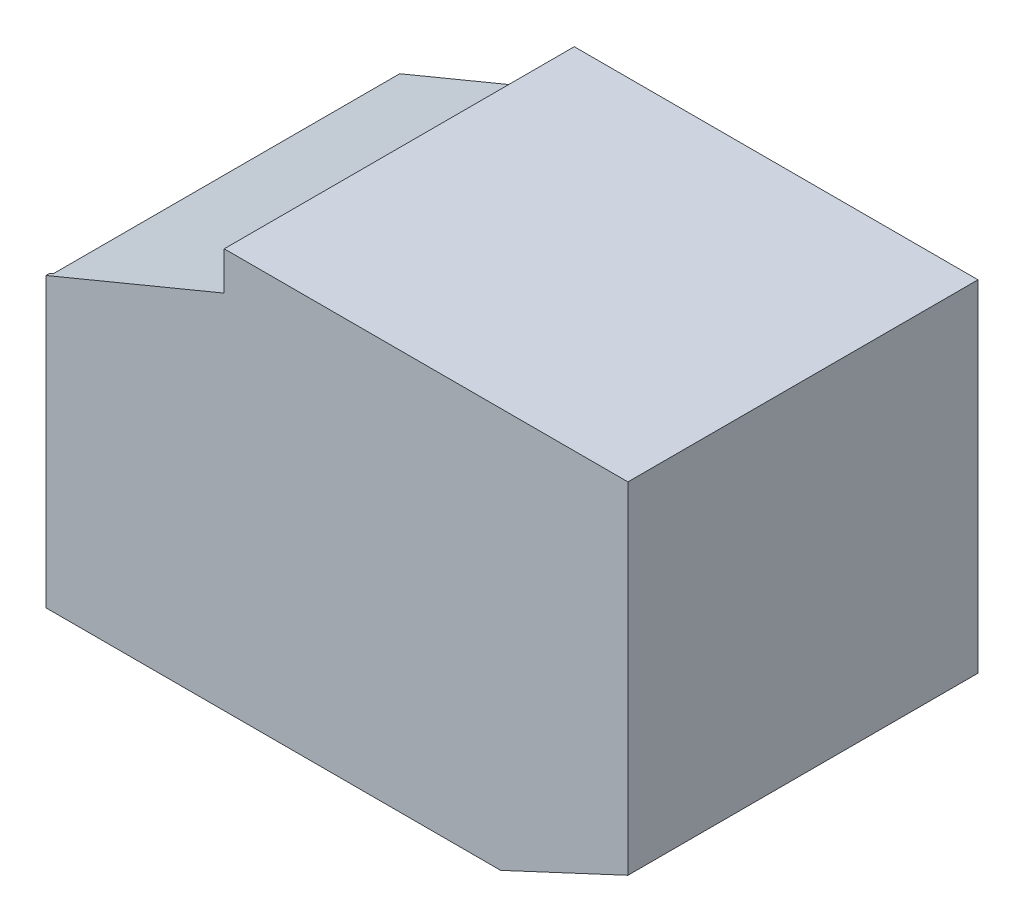
ISO-10303-21;
HEADER;
FILE_DESCRIPTION(('STEP AP214'),'2;1');
FILE_NAME('part.step','',(''),(''),'','','');
FILE_SCHEMA(('AUTOMOTIVE_DESIGN { 1 0 10303 214 1 1 1 1 }'));
ENDSEC;
DATA;
#1=APPLICATION_CONTEXT('core data for automotive mechanical design processes');
#2=APPLICATION_PROTOCOL_DEFINITION('international standard','automotive_design',2000,#1);
#3=PRODUCT_CONTEXT('',#1,'mechanical');
#4=PRODUCT('Part','Part','',(#3));
#5=PRODUCT_RELATED_PRODUCT_CATEGORY('part','',(#4));
#6=PRODUCT_DEFINITION_FORMATION('','',#4);
#7=PRODUCT_DEFINITION_CONTEXT('part definition',#1,'design');
#8=PRODUCT_DEFINITION('design','',#6,#7);
#9=PRODUCT_DEFINITION_SHAPE('','',#8);
#10=(LENGTH_UNIT() NAMED_UNIT(*) SI_UNIT(.MILLI.,.METRE.));
#11=(NAMED_UNIT(*) PLANE_ANGLE_UNIT() SI_UNIT($,.RADIAN.));
#12=(NAMED_UNIT(*) SI_UNIT($,.STERADIAN.) SOLID_ANGLE_UNIT());
#13=UNCERTAINTY_MEASURE_WITH_UNIT(LENGTH_MEASURE(1.E-05),#10,'distance_accuracy_value','');
#14=(GEOMETRIC_REPRESENTATION_CONTEXT(3) GLOBAL_UNCERTAINTY_ASSIGNED_CONTEXT((#13)) GLOBAL_UNIT_ASSIGNED_CONTEXT((#10,
#11,#12)) REPRESENTATION_CONTEXT('',''));
#15=CARTESIAN_POINT('',(0.,0.,0.));
#16=DIRECTION('',(0.,0.,1.));
#17=DIRECTION('',(1.,0.,0.));
#18=AXIS2_PLACEMENT_3D('',#15,#16,#17);
#19=CARTESIAN_POINT('',(-240.,390.,1390.65));
#20=DIRECTION('',(0.,1.,0.));
#21=DIRECTION('',(-1.,0.,0.));
#22=AXIS2_PLACEMENT_3D('',#19,#20,#21);
#23=PLANE('',#22);
#24=DIRECTION('',(1.,0.,0.));
#25=VECTOR('',#24,1.);
#26=CARTESIAN_POINT('',(-560.,390.,1583.15));
#27=LINE('',#26,#25);
#28=CARTESIAN_POINT('',(-560.,390.,1583.15));
#29=VERTEX_POINT('',#28);
#30=CARTESIAN_POINT('',(-310.,390.,1583.15));
#31=VERTEX_POINT('',#30);
#32=EDGE_CURVE('E160',#29,#31,#27,.T.);
#33=ORIENTED_EDGE('',*,*,#32,.F.);
#34=DIRECTION('',(0.,0.,1.));
#35=VECTOR('',#34,1.);
#36=CARTESIAN_POINT('',(-560.,390.,1390.65));
#37=LINE('',#36,#35);
#38=CARTESIAN_POINT('',(-560.,390.,1390.65));
#39=VERTEX_POINT('',#38);
#40=EDGE_CURVE('E42',#39,#29,#37,.T.);
#41=ORIENTED_EDGE('',*,*,#40,.F.);
#42=DIRECTION('',(-1.,0.,0.));
#43=VECTOR('',#42,1.);
#44=CARTESIAN_POINT('',(-310.,390.,1390.65));
#45=LINE('',#44,#43);
#46=CARTESIAN_POINT('',(-310.,390.,1390.65));
#47=VERTEX_POINT('',#46);
#48=EDGE_CURVE('E190',#47,#39,#45,.T.);
#49=ORIENTED_EDGE('',*,*,#48,.F.);
#50=DIRECTION('',(0.,0.,1.));
#51=VECTOR('',#50,1.);
#52=CARTESIAN_POINT('',(-310.,390.,1390.65));
#53=LINE('',#52,#51);
#54=EDGE_CURVE('E11',#47,#31,#53,.T.);
#55=ORIENTED_EDGE('',*,*,#54,.T.);
#56=EDGE_LOOP('',(#33,#41,#49,#55));
#57=FACE_BOUND('',#56,.T.);
#58=ADVANCED_FACE('F17',(#57),#23,.F.);
#59=CARTESIAN_POINT('',(-310.,390.,1390.65));
#60=DIRECTION('',(-0.422618261740681,0.906307787036659,0.));
#61=DIRECTION('',(0.,0.,-1.));
#62=AXIS2_PLACEMENT_3D('',#59,#60,#61);
#63=PLANE('',#62);
#64=ORIENTED_EDGE('',*,*,#54,.F.);
#65=DIRECTION('',(0.906307787036659,0.422618261740681,0.));
#66=VECTOR('',#65,1.);
#67=CARTESIAN_POINT('',(-310.,390.,1390.65));
#68=LINE('',#67,#66);
#69=CARTESIAN_POINT('',(-240.,422.64153607085,1390.65));
#70=VERTEX_POINT('',#69);
#71=EDGE_CURVE('E28',#47,#70,#68,.T.);
#72=ORIENTED_EDGE('',*,*,#71,.T.);
#73=DIRECTION('',(0.,0.,-1.));
#74=VECTOR('',#73,1.);
#75=CARTESIAN_POINT('',(-240.,422.64153607085,1583.15));
#76=LINE('',#75,#74);
#77=CARTESIAN_POINT('',(-240.,422.64153607085,1583.15));
#78=VERTEX_POINT('',#77);
#79=EDGE_CURVE('E219',#78,#70,#76,.T.);
#80=ORIENTED_EDGE('',*,*,#79,.F.);
#81=DIRECTION('',(-0.906307787036659,-0.422618261740681,0.));
#82=VECTOR('',#81,1.);
#83=CARTESIAN_POINT('',(-240.,422.64153607085,1583.15));
#84=LINE('',#83,#82);
#85=EDGE_CURVE('E147',#78,#31,#84,.T.);
#86=ORIENTED_EDGE('',*,*,#85,.T.);
#87=EDGE_LOOP('',(#64,#72,#80,#86));
#88=FACE_BOUND('',#87,.T.);
#89=ADVANCED_FACE('F254',(#88),#63,.F.);
#90=CARTESIAN_POINT('',(-560.,390.,1583.15));
#91=DIRECTION('',(0.,0.,1.));
#92=DIRECTION('',(-1.,0.,0.));
#93=AXIS2_PLACEMENT_3D('',#90,#91,#92);
#94=PLANE('',#93);
#95=DIRECTION('',(-0.923879532511285,-0.382683432365094,0.));
#96=VECTOR('',#95,1.);
#97=CARTESIAN_POINT('',(-462.,588.8929291126,1583.15));
#98=LINE('',#97,#96);
#99=CARTESIAN_POINT('',(-462.,588.8929291126,1583.15));
#100=VERTEX_POINT('',#99);
#101=CARTESIAN_POINT('',(-560.,548.3,1583.15));
#102=VERTEX_POINT('',#101);
#103=EDGE_CURVE('E150',#100,#102,#98,.T.);
#104=ORIENTED_EDGE('',*,*,#103,.T.);
#105=DIRECTION('',(0.,1.,0.));
#106=VECTOR('',#105,1.);
#107=CARTESIAN_POINT('',(-560.,390.,1583.15));
#108=LINE('',#107,#106);
#109=EDGE_CURVE('E143',#29,#102,#108,.T.);
#110=ORIENTED_EDGE('',*,*,#109,.F.);
#111=ORIENTED_EDGE('',*,*,#32,.T.);
#112=ORIENTED_EDGE('',*,*,#85,.F.);
#113=DIRECTION('',(0.,1.,0.));
#114=VECTOR('',#113,1.);
#115=CARTESIAN_POINT('',(-240.,422.64153607085,1583.15));
#116=LINE('',#115,#114);
#117=CARTESIAN_POINT('',(-240.,610.,1583.15));
#118=VERTEX_POINT('',#117);
#119=EDGE_CURVE('E168',#78,#118,#116,.T.);
#120=ORIENTED_EDGE('',*,*,#119,.T.);
#121=DIRECTION('',(1.,0.,0.));
#122=VECTOR('',#121,1.);
#123=CARTESIAN_POINT('',(-462.,610.,1583.15));
#124=LINE('',#123,#122);
#125=CARTESIAN_POINT('',(-462.,610.,1583.15));
#126=VERTEX_POINT('',#125);
#127=EDGE_CURVE('E176',#126,#118,#124,.T.);
#128=ORIENTED_EDGE('',*,*,#127,.F.);
#129=DIRECTION('',(0.,-1.,0.));
#130=VECTOR('',#129,1.);
#131=CARTESIAN_POINT('',(-462.,610.,1583.15));
#132=LINE('',#131,#130);
#133=EDGE_CURVE('E180',#126,#100,#132,.T.);
#134=ORIENTED_EDGE('',*,*,#133,.T.);
#135=EDGE_LOOP('',(#104,#110,#111,#112,#120,#128,#134));
#136=FACE_BOUND('',#135,.T.);
#137=ADVANCED_FACE('F19',(#136),#94,.T.);
#138=CARTESIAN_POINT('',(-462.,610.,1390.65));
#139=DIRECTION('',(1.,0.,0.));
#140=DIRECTION('',(0.,1.,0.));
#141=AXIS2_PLACEMENT_3D('',#138,#139,#140);
#142=PLANE('',#141);
#143=DIRECTION('',(0.,-1.,0.));
#144=VECTOR('',#143,1.);
#145=CARTESIAN_POINT('',(-462.,610.,1390.65));
#146=LINE('',#145,#144);
#147=CARTESIAN_POINT('',(-462.,610.,1390.65));
#148=VERTEX_POINT('',#147);
#149=CARTESIAN_POINT('',(-462.,588.8929291126,1390.65));
#150=VERTEX_POINT('',#149);
#151=EDGE_CURVE('E199',#148,#150,#146,.T.);
#152=ORIENTED_EDGE('',*,*,#151,.T.);
#153=DIRECTION('',(0.,0.,1.));
#154=VECTOR('',#153,1.);
#155=CARTESIAN_POINT('',(-462.,588.8929291126,1390.65));
#156=LINE('',#155,#154);
#157=EDGE_CURVE('E21',#150,#100,#156,.T.);
#158=ORIENTED_EDGE('',*,*,#157,.T.);
#159=ORIENTED_EDGE('',*,*,#133,.F.);
#160=DIRECTION('',(0.,0.,1.));
#161=VECTOR('',#160,1.);
#162=CARTESIAN_POINT('',(-462.,610.,1390.65));
#163=LINE('',#162,#161);
#164=EDGE_CURVE('E186',#148,#126,#163,.T.);
#165=ORIENTED_EDGE('',*,*,#164,.F.);
#166=EDGE_LOOP('',(#152,#158,#159,#165));
#167=FACE_BOUND('',#166,.T.);
#168=ADVANCED_FACE('F259',(#167),#142,.F.);
#169=CARTESIAN_POINT('',(-240.,610.,1390.65));
#170=DIRECTION('',(0.,1.,0.));
#171=DIRECTION('',(-1.,0.,0.));
#172=AXIS2_PLACEMENT_3D('',#169,#170,#171);
#173=PLANE('',#172);
#174=ORIENTED_EDGE('',*,*,#127,.T.);
#175=DIRECTION('',(0.,0.,-1.));
#176=VECTOR('',#175,1.);
#177=CARTESIAN_POINT('',(-240.,610.,1583.15));
#178=LINE('',#177,#176);
#179=CARTESIAN_POINT('',(-240.,610.,1390.65));
#180=VERTEX_POINT('',#179);
#181=EDGE_CURVE('E172',#118,#180,#178,.T.);
#182=ORIENTED_EDGE('',*,*,#181,.T.);
#183=DIRECTION('',(-1.,0.,0.));
#184=VECTOR('',#183,1.);
#185=CARTESIAN_POINT('',(-240.,610.,1390.65));
#186=LINE('',#185,#184);
#187=EDGE_CURVE('E177',#180,#148,#186,.T.);
#188=ORIENTED_EDGE('',*,*,#187,.T.);
#189=ORIENTED_EDGE('',*,*,#164,.T.);
#190=EDGE_LOOP('',(#174,#182,#188,#189));
#191=FACE_BOUND('',#190,.T.);
#192=ADVANCED_FACE('F257',(#191),#173,.T.);
#193=CARTESIAN_POINT('',(-240.,390.,1390.65));
#194=DIRECTION('',(0.,0.,-1.));
#195=DIRECTION('',(0.,-1.,0.));
#196=AXIS2_PLACEMENT_3D('',#193,#194,#195);
#197=PLANE('',#196);
#198=DIRECTION('',(0.,-1.,0.));
#199=VECTOR('',#198,1.);
#200=CARTESIAN_POINT('',(-558.,549.1284271247,1390.65));
#201=LINE('',#200,#199);
#202=CARTESIAN_POINT('',(-558.,549.1284271247,1390.65));
#203=VERTEX_POINT('',#202);
#204=CARTESIAN_POINT('',(-558.,542.,1390.65));
#205=VERTEX_POINT('',#204);
#206=EDGE_CURVE('E124',#203,#205,#201,.T.);
#207=ORIENTED_EDGE('',*,*,#206,.F.);
#208=DIRECTION('',(-0.923879532511285,-0.382683432365094,0.));
#209=VECTOR('',#208,1.);
#210=CARTESIAN_POINT('',(-462.,588.8929291126,1390.65));
#211=LINE('',#210,#209);
#212=EDGE_CURVE('E185',#150,#203,#211,.T.);
#213=ORIENTED_EDGE('',*,*,#212,.F.);
#214=ORIENTED_EDGE('',*,*,#151,.F.);
#215=ORIENTED_EDGE('',*,*,#187,.F.);
#216=DIRECTION('',(0.,1.,0.));
#217=VECTOR('',#216,1.);
#218=CARTESIAN_POINT('',(-240.,422.64153607085,1390.65));
#219=LINE('',#218,#217);
#220=EDGE_CURVE('E144',#70,#180,#219,.T.);
#221=ORIENTED_EDGE('',*,*,#220,.F.);
#222=ORIENTED_EDGE('',*,*,#71,.F.);
#223=ORIENTED_EDGE('',*,*,#48,.T.);
#224=DIRECTION('',(0.,1.,0.));
#225=VECTOR('',#224,1.);
#226=CARTESIAN_POINT('',(-560.,390.,1390.65));
#227=LINE('',#226,#225);
#228=CARTESIAN_POINT('',(-560.,542.,1390.65));
#229=VERTEX_POINT('',#228);
#230=EDGE_CURVE('E171',#39,#229,#227,.T.);
#231=ORIENTED_EDGE('',*,*,#230,.T.);
#232=DIRECTION('',(1.,0.,0.));
#233=VECTOR('',#232,1.);
#234=CARTESIAN_POINT('',(-560.,542.,1390.65));
#235=LINE('',#234,#233);
#236=EDGE_CURVE('E146',#229,#205,#235,.T.);
#237=ORIENTED_EDGE('',*,*,#236,.T.);
#238=EDGE_LOOP('',(#207,#213,#214,#215,#221,#222,#223,#231,#237));
#239=FACE_BOUND('',#238,.T.);
#240=ADVANCED_FACE('F232',(#239),#197,.T.);
#241=CARTESIAN_POINT('',(-558.,542.,1390.65));
#242=DIRECTION('',(0.,-1.,0.));
#243=DIRECTION('',(0.,0.,-1.));
#244=AXIS2_PLACEMENT_3D('',#241,#242,#243);
#245=PLANE('',#244);
#246=DIRECTION('',(0.,0.,1.));
#247=VECTOR('',#246,1.);
#248=CARTESIAN_POINT('',(-560.,542.,1390.65));
#249=LINE('',#248,#247);
#250=CARTESIAN_POINT('',(-560.,542.,1581.15));
#251=VERTEX_POINT('',#250);
#252=EDGE_CURVE('E111',#229,#251,#249,.T.);
#253=ORIENTED_EDGE('',*,*,#252,.T.);
#254=DIRECTION('',(-1.,0.,0.));
#255=VECTOR('',#254,1.);
#256=CARTESIAN_POINT('',(-558.,542.,1581.15));
#257=LINE('',#256,#255);
#258=CARTESIAN_POINT('',(-558.,542.,1581.15));
#259=VERTEX_POINT('',#258);
#260=EDGE_CURVE('E105',#259,#251,#257,.T.);
#261=ORIENTED_EDGE('',*,*,#260,.F.);
#262=DIRECTION('',(0.,0.,1.));
#263=VECTOR('',#262,1.);
#264=CARTESIAN_POINT('',(-558.,542.,1390.65));
#265=LINE('',#264,#263);
#266=EDGE_CURVE('E109',#205,#259,#265,.T.);
#267=ORIENTED_EDGE('',*,*,#266,.F.);
#268=ORIENTED_EDGE('',*,*,#236,.F.);
#269=EDGE_LOOP('',(#253,#261,#267,#268));
#270=FACE_BOUND('',#269,.T.);
#271=ADVANCED_FACE('F107',(#270),#245,.F.);
#272=CARTESIAN_POINT('',(-558.,562.,1390.65));
#273=DIRECTION('',(1.,0.,0.));
#274=DIRECTION('',(0.,1.,0.));
#275=AXIS2_PLACEMENT_3D('',#272,#273,#274);
#276=PLANE('',#275);
#277=ORIENTED_EDGE('',*,*,#266,.T.);
#278=DIRECTION('',(0.,-1.,0.));
#279=VECTOR('',#278,1.);
#280=CARTESIAN_POINT('',(-558.,549.1284271247,1581.15));
#281=LINE('',#280,#279);
#282=CARTESIAN_POINT('',(-558.,549.1284271247,1581.15));
#283=VERTEX_POINT('',#282);
#284=EDGE_CURVE('E117',#283,#259,#281,.T.);
#285=ORIENTED_EDGE('',*,*,#284,.F.);
#286=DIRECTION('',(0.,0.,1.));
#287=VECTOR('',#286,1.);
#288=CARTESIAN_POINT('',(-558.,549.1284271247,1390.65));
#289=LINE('',#288,#287);
#290=EDGE_CURVE('E135',#203,#283,#289,.T.);
#291=ORIENTED_EDGE('',*,*,#290,.F.);
#292=ORIENTED_EDGE('',*,*,#206,.T.);
#293=EDGE_LOOP('',(#277,#285,#291,#292));
#294=FACE_BOUND('',#293,.T.);
#295=ADVANCED_FACE('F120',(#294),#276,.F.);
#296=CARTESIAN_POINT('',(-462.,588.8929291126,1390.65));
#297=DIRECTION('',(0.382683432365094,-0.923879532511285,0.));
#298=DIRECTION('',(0.923879532511285,0.382683432365094,0.));
#299=AXIS2_PLACEMENT_3D('',#296,#297,#298);
#300=PLANE('',#299);
#301=DIRECTION('',(0.,0.,1.));
#302=VECTOR('',#301,1.);
#303=CARTESIAN_POINT('',(-560.,548.3,1581.15));
#304=LINE('',#303,#302);
#305=CARTESIAN_POINT('',(-560.,548.3,1581.15));
#306=VERTEX_POINT('',#305);
#307=EDGE_CURVE('E182',#306,#102,#304,.T.);
#308=ORIENTED_EDGE('',*,*,#307,.T.);
#309=ORIENTED_EDGE('',*,*,#103,.F.);
#310=ORIENTED_EDGE('',*,*,#157,.F.);
#311=ORIENTED_EDGE('',*,*,#212,.T.);
#312=ORIENTED_EDGE('',*,*,#290,.T.);
#313=DIRECTION('',(0.923879532511285,0.382683432365094,0.));
#314=VECTOR('',#313,1.);
#315=CARTESIAN_POINT('',(-560.,548.3,1581.15));
#316=LINE('',#315,#314);
#317=EDGE_CURVE('E130',#306,#283,#316,.T.);
#318=ORIENTED_EDGE('',*,*,#317,.F.);
#319=EDGE_LOOP('',(#308,#309,#310,#311,#312,#318));
#320=FACE_BOUND('',#319,.T.);
#321=ADVANCED_FACE('F238',(#320),#300,.F.);
#322=CARTESIAN_POINT('',(-560.,390.,1581.15));
#323=DIRECTION('',(0.,0.,1.));
#324=DIRECTION('',(-1.,0.,0.));
#325=AXIS2_PLACEMENT_3D('',#322,#323,#324);
#326=PLANE('',#325);
#327=ORIENTED_EDGE('',*,*,#317,.T.);
#328=ORIENTED_EDGE('',*,*,#284,.T.);
#329=ORIENTED_EDGE('',*,*,#260,.T.);
#330=DIRECTION('',(0.,-1.,0.));
#331=VECTOR('',#330,1.);
#332=CARTESIAN_POINT('',(-560.,548.3,1581.15));
#333=LINE('',#332,#331);
#334=EDGE_CURVE('E140',#306,#251,#333,.T.);
#335=ORIENTED_EDGE('',*,*,#334,.F.);
#336=EDGE_LOOP('',(#327,#328,#329,#335));
#337=FACE_BOUND('',#336,.T.);
#338=ADVANCED_FACE('F129',(#337),#326,.F.);
#339=CARTESIAN_POINT('',(-560.,390.,1390.65));
#340=DIRECTION('',(-1.,0.,0.));
#341=DIRECTION('',(0.,0.,1.));
#342=AXIS2_PLACEMENT_3D('',#339,#340,#341);
#343=PLANE('',#342);
#344=ORIENTED_EDGE('',*,*,#252,.F.);
#345=ORIENTED_EDGE('',*,*,#230,.F.);
#346=ORIENTED_EDGE('',*,*,#40,.T.);
#347=ORIENTED_EDGE('',*,*,#109,.T.);
#348=ORIENTED_EDGE('',*,*,#307,.F.);
#349=ORIENTED_EDGE('',*,*,#334,.T.);
#350=EDGE_LOOP('',(#344,#345,#346,#347,#348,#349));
#351=FACE_BOUND('',#350,.T.);
#352=ADVANCED_FACE('F235',(#351),#343,.T.);
#353=CARTESIAN_POINT('',(-240.,390.,1583.15));
#354=DIRECTION('',(1.,0.,0.));
#355=DIRECTION('',(0.,1.,0.));
#356=AXIS2_PLACEMENT_3D('',#353,#354,#355);
#357=PLANE('',#356);
#358=ORIENTED_EDGE('',*,*,#220,.T.);
#359=ORIENTED_EDGE('',*,*,#181,.F.);
#360=ORIENTED_EDGE('',*,*,#119,.F.);
#361=ORIENTED_EDGE('',*,*,#79,.T.);
#362=EDGE_LOOP('',(#358,#359,#360,#361));
#363=FACE_BOUND('',#362,.T.);
#364=ADVANCED_FACE('F251',(#363),#357,.T.);
#365=CLOSED_SHELL('',(#58,#89,#137,#168,#192,#240,#271,#295,#321,#338,#352,#364));
#366=MANIFOLD_SOLID_BREP('B1',#365);
#367=ADVANCED_BREP_SHAPE_REPRESENTATION('',(#18,#366),#14);
#368=SHAPE_DEFINITION_REPRESENTATION(#9,#367);
ENDSEC;
END-ISO-10303-21;
